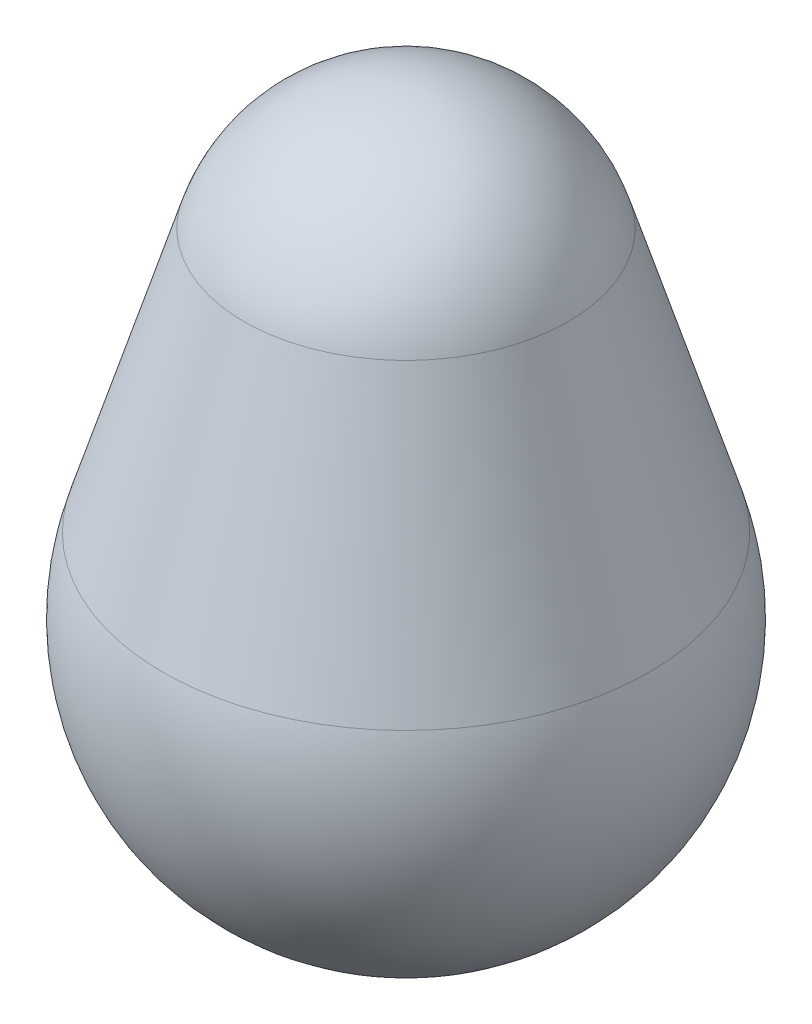
ISO-10303-21;
HEADER;
FILE_DESCRIPTION(('STEP AP214'),'2;1');
FILE_NAME('part.step','',(''),(''),'','','');
FILE_SCHEMA(('AUTOMOTIVE_DESIGN { 1 0 10303 214 1 1 1 1 }'));
ENDSEC;
DATA;
#1=APPLICATION_CONTEXT('core data for automotive mechanical design processes');
#2=APPLICATION_PROTOCOL_DEFINITION('international standard','automotive_design',2000,#1);
#3=PRODUCT_CONTEXT('',#1,'mechanical');
#4=PRODUCT('Part','Part','',(#3));
#5=PRODUCT_RELATED_PRODUCT_CATEGORY('part','',(#4));
#6=PRODUCT_DEFINITION_FORMATION('','',#4);
#7=PRODUCT_DEFINITION_CONTEXT('part definition',#1,'design');
#8=PRODUCT_DEFINITION('design','',#6,#7);
#9=PRODUCT_DEFINITION_SHAPE('','',#8);
#10=(LENGTH_UNIT() NAMED_UNIT(*) SI_UNIT(.MILLI.,.METRE.));
#11=(NAMED_UNIT(*) PLANE_ANGLE_UNIT() SI_UNIT($,.RADIAN.));
#12=(NAMED_UNIT(*) SI_UNIT($,.STERADIAN.) SOLID_ANGLE_UNIT());
#13=UNCERTAINTY_MEASURE_WITH_UNIT(LENGTH_MEASURE(1.E-05),#10,'distance_accuracy_value','');
#14=(GEOMETRIC_REPRESENTATION_CONTEXT(3) GLOBAL_UNCERTAINTY_ASSIGNED_CONTEXT((#13)) GLOBAL_UNIT_ASSIGNED_CONTEXT((#10,
#11,#12)) REPRESENTATION_CONTEXT('',''));
#15=CARTESIAN_POINT('',(0.,0.,0.));
#16=DIRECTION('',(0.,0.,1.));
#17=DIRECTION('',(1.,0.,0.));
#18=AXIS2_PLACEMENT_3D('',#15,#16,#17);
#19=CARTESIAN_POINT('',(0.,85.,0.));
#20=DIRECTION('',(1.,0.,0.));
#21=DIRECTION('',(0.,1.,0.));
#22=AXIS2_PLACEMENT_3D('',#19,#20,#21);
#23=SPHERICAL_SURFACE('',#22,50.);
#24=CARTESIAN_POINT('',(0.,99.7058823529412,0.));
#25=DIRECTION('',(0.,-1.,0.));
#26=DIRECTION('',(0.,0.,-1.));
#27=AXIS2_PLACEMENT_3D('',#24,#25,#26);
#28=CIRCLE('',#27,47.788461203741);
#29=CARTESIAN_POINT('',(0.,99.7058823529412,-47.788461203741));
#30=VERTEX_POINT('',#29);
#31=EDGE_CURVE('E19',#30,#30,#28,.T.);
#32=ORIENTED_EDGE('',*,*,#31,.F.);
#33=EDGE_LOOP('',(#32));
#34=FACE_BOUND('',#33,.T.);
#35=ADVANCED_FACE('F15',(#34),#23,.T.);
#36=CARTESIAN_POINT('',(0.,22.0588235294118,0.));
#37=DIRECTION('',(0.,-1.,0.));
#38=DIRECTION('',(0.,0.,-1.));
#39=AXIS2_PLACEMENT_3D('',#36,#37,#38);
#40=CONICAL_SURFACE('',#39,71.6826918056114,0.298532201184876);
#41=ORIENTED_EDGE('',*,*,#31,.T.);
#42=EDGE_LOOP('',(#41));
#43=FACE_BOUND('',#42,.T.);
#44=CARTESIAN_POINT('',(0.,22.0588235294118,0.));
#45=DIRECTION('',(0.,-1.,0.));
#46=DIRECTION('',(0.,0.,-1.));
#47=AXIS2_PLACEMENT_3D('',#44,#45,#46);
#48=CIRCLE('',#47,71.6826918056114);
#49=CARTESIAN_POINT('',(0.,22.0588235294118,-71.6826918056114));
#50=VERTEX_POINT('',#49);
#51=EDGE_CURVE('E10',#50,#50,#48,.T.);
#52=ORIENTED_EDGE('',*,*,#51,.F.);
#53=EDGE_LOOP('',(#52));
#54=FACE_BOUND('',#53,.T.);
#55=ADVANCED_FACE('F28',(#43,#54),#40,.T.);
#56=CARTESIAN_POINT('',(0.,0.,0.));
#57=DIRECTION('',(0.,-1.,0.));
#58=DIRECTION('',(0.,0.,-1.));
#59=AXIS2_PLACEMENT_3D('',#56,#57,#58);
#60=SPHERICAL_SURFACE('',#59,75.);
#61=CARTESIAN_POINT('',(0.,-75.,0.));
#62=VERTEX_POINT('',#61);
#63=VERTEX_LOOP('',#62);
#64=FACE_BOUND('',#63,.T.);
#65=ORIENTED_EDGE('',*,*,#51,.T.);
#66=EDGE_LOOP('',(#65));
#67=FACE_BOUND('',#66,.T.);
#68=ADVANCED_FACE('F25',(#64,#67),#60,.T.);
#69=CLOSED_SHELL('',(#35,#55,#68));
#70=MANIFOLD_SOLID_BREP('B1',#69);
#71=ADVANCED_BREP_SHAPE_REPRESENTATION('',(#18,#70),#14);
#72=SHAPE_DEFINITION_REPRESENTATION(#9,#71);
ENDSEC;
END-ISO-10303-21;
